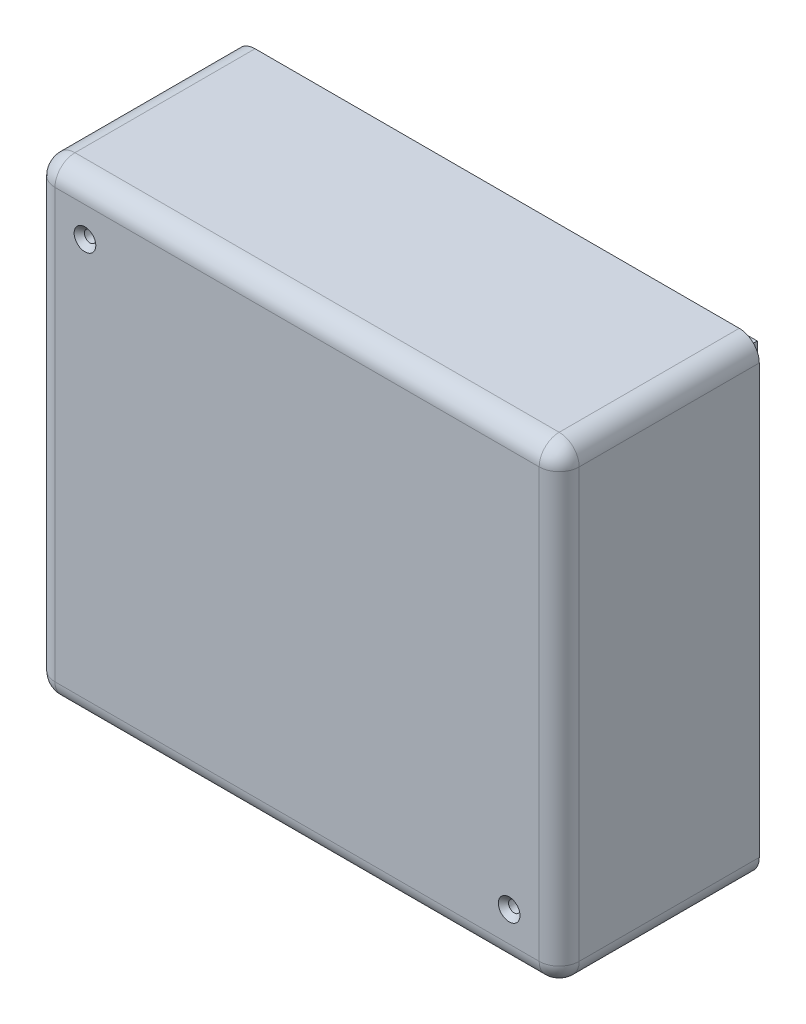
ISO-10303-21;
HEADER;
FILE_DESCRIPTION(('STEP AP214'),'2;1');
FILE_NAME('part.step','',(''),(''),'','','');
FILE_SCHEMA(('AUTOMOTIVE_DESIGN { 1 0 10303 214 1 1 1 1 }'));
ENDSEC;
DATA;
#1=APPLICATION_CONTEXT('core data for automotive mechanical design processes');
#2=APPLICATION_PROTOCOL_DEFINITION('international standard','automotive_design',2000,#1);
#3=PRODUCT_CONTEXT('',#1,'mechanical');
#4=PRODUCT('Part','Part','',(#3));
#5=PRODUCT_RELATED_PRODUCT_CATEGORY('part','',(#4));
#6=PRODUCT_DEFINITION_FORMATION('','',#4);
#7=PRODUCT_DEFINITION_CONTEXT('part definition',#1,'design');
#8=PRODUCT_DEFINITION('design','',#6,#7);
#9=PRODUCT_DEFINITION_SHAPE('','',#8);
#10=(LENGTH_UNIT() NAMED_UNIT(*) SI_UNIT(.MILLI.,.METRE.));
#11=(NAMED_UNIT(*) PLANE_ANGLE_UNIT() SI_UNIT($,.RADIAN.));
#12=(NAMED_UNIT(*) SI_UNIT($,.STERADIAN.) SOLID_ANGLE_UNIT());
#13=UNCERTAINTY_MEASURE_WITH_UNIT(LENGTH_MEASURE(1.E-05),#10,'distance_accuracy_value','');
#14=(GEOMETRIC_REPRESENTATION_CONTEXT(3) GLOBAL_UNCERTAINTY_ASSIGNED_CONTEXT((#13)) GLOBAL_UNIT_ASSIGNED_CONTEXT((#10,
#11,#12)) REPRESENTATION_CONTEXT('',''));
#15=CARTESIAN_POINT('',(0.,0.,0.));
#16=DIRECTION('',(0.,0.,1.));
#17=DIRECTION('',(1.,0.,0.));
#18=AXIS2_PLACEMENT_3D('',#15,#16,#17);
#19=CARTESIAN_POINT('',(3.04800000000001,0.,-2.54));
#20=DIRECTION('',(-1.,0.,0.));
#21=DIRECTION('',(0.,-1.,0.));
#22=AXIS2_PLACEMENT_3D('',#19,#20,#21);
#23=PLANE('',#22);
#24=DIRECTION('',(0.,0.,-1.));
#25=VECTOR('',#24,1.);
#26=CARTESIAN_POINT('',(3.048,74.168,-2.54));
#27=LINE('',#26,#25);
#28=CARTESIAN_POINT('',(3.048,74.168,0.));
#29=VERTEX_POINT('',#28);
#30=CARTESIAN_POINT('',(3.048,74.168,-2.54));
#31=VERTEX_POINT('',#30);
#32=EDGE_CURVE('E393',#29,#31,#27,.T.);
#33=ORIENTED_EDGE('',*,*,#32,.F.);
#34=DIRECTION('',(0.,-1.,0.));
#35=VECTOR('',#34,1.);
#36=CARTESIAN_POINT('',(3.04800000000001,0.,0.));
#37=LINE('',#36,#35);
#38=CARTESIAN_POINT('',(3.048,115.824,0.));
#39=VERTEX_POINT('',#38);
#40=EDGE_CURVE('E337',#39,#29,#37,.T.);
#41=ORIENTED_EDGE('',*,*,#40,.F.);
#42=DIRECTION('',(0.,0.,1.));
#43=VECTOR('',#42,1.);
#44=CARTESIAN_POINT('',(3.048,115.824,-2.54));
#45=LINE('',#44,#43);
#46=CARTESIAN_POINT('',(3.048,115.824,-2.54));
#47=VERTEX_POINT('',#46);
#48=EDGE_CURVE('E336',#47,#39,#45,.T.);
#49=ORIENTED_EDGE('',*,*,#48,.F.);
#50=DIRECTION('',(0.,-1.,0.));
#51=VECTOR('',#50,1.);
#52=CARTESIAN_POINT('',(3.04800000000001,0.,-2.54));
#53=LINE('',#52,#51);
#54=EDGE_CURVE('E324',#47,#31,#53,.T.);
#55=ORIENTED_EDGE('',*,*,#54,.T.);
#56=EDGE_LOOP('',(#33,#41,#49,#55));
#57=FACE_BOUND('',#56,.T.);
#58=ADVANCED_FACE('F105',(#57),#23,.T.);
#59=CARTESIAN_POINT('',(0.,118.872,50.8));
#60=DIRECTION('',(1.,0.,0.));
#61=DIRECTION('',(0.,1.,0.));
#62=AXIS2_PLACEMENT_3D('',#59,#60,#61);
#63=PLANE('',#62);
#64=DIRECTION('',(0.,-1.,0.));
#65=VECTOR('',#64,1.);
#66=CARTESIAN_POINT('',(0.,118.872,45.72));
#67=LINE('',#66,#65);
#68=CARTESIAN_POINT('',(0.,5.08,45.72));
#69=VERTEX_POINT('',#68);
#70=CARTESIAN_POINT('',(0.,113.792,45.72));
#71=VERTEX_POINT('',#70);
#72=EDGE_CURVE('E414',#69,#71,#67,.F.);
#73=ORIENTED_EDGE('',*,*,#72,.T.);
#74=DIRECTION('',(0.,0.,-1.));
#75=VECTOR('',#74,1.);
#76=CARTESIAN_POINT('',(0.,113.792,0.));
#77=LINE('',#76,#75);
#78=CARTESIAN_POINT('',(0.,113.792,0.));
#79=VERTEX_POINT('',#78);
#80=EDGE_CURVE('E416',#71,#79,#77,.T.);
#81=ORIENTED_EDGE('',*,*,#80,.T.);
#82=DIRECTION('',(0.,-1.,0.));
#83=VECTOR('',#82,1.);
#84=CARTESIAN_POINT('',(0.,118.872,0.));
#85=LINE('',#84,#83);
#86=CARTESIAN_POINT('',(0.,74.168,0.));
#87=VERTEX_POINT('',#86);
#88=EDGE_CURVE('E380',#79,#87,#85,.T.);
#89=ORIENTED_EDGE('',*,*,#88,.T.);
#90=DIRECTION('',(0.,0.,-1.));
#91=VECTOR('',#90,1.);
#92=CARTESIAN_POINT('',(0.,74.168,-2.54));
#93=LINE('',#92,#91);
#94=CARTESIAN_POINT('',(0.,74.168,13.9160078385243));
#95=VERTEX_POINT('',#94);
#96=EDGE_CURVE('E292',#95,#87,#93,.T.);
#97=ORIENTED_EDGE('',*,*,#96,.F.);
#98=DIRECTION('',(0.,1.,0.));
#99=VECTOR('',#98,1.);
#100=CARTESIAN_POINT('',(0.,74.168,13.9160078385243));
#101=LINE('',#100,#99);
#102=CARTESIAN_POINT('',(0.,11.684,13.9160078385243));
#103=VERTEX_POINT('',#102);
#104=EDGE_CURVE('E271',#103,#95,#101,.T.);
#105=ORIENTED_EDGE('',*,*,#104,.F.);
#106=DIRECTION('',(0.,0.,1.));
#107=VECTOR('',#106,1.);
#108=CARTESIAN_POINT('',(0.,11.684,13.9160078385243));
#109=LINE('',#108,#107);
#110=CARTESIAN_POINT('',(0.,11.684,0.));
#111=VERTEX_POINT('',#110);
#112=EDGE_CURVE('E281',#111,#103,#109,.T.);
#113=ORIENTED_EDGE('',*,*,#112,.F.);
#114=CARTESIAN_POINT('',(0.,5.08,0.));
#115=VERTEX_POINT('',#114);
#116=EDGE_CURVE('E374',#111,#115,#85,.T.);
#117=ORIENTED_EDGE('',*,*,#116,.T.);
#118=DIRECTION('',(0.,0.,-1.));
#119=VECTOR('',#118,1.);
#120=CARTESIAN_POINT('',(0.,5.08,50.8));
#121=LINE('',#120,#119);
#122=EDGE_CURVE('E412',#115,#69,#121,.F.);
#123=ORIENTED_EDGE('',*,*,#122,.T.);
#124=EDGE_LOOP('',(#73,#81,#89,#97,#105,#113,#117,#123));
#125=FACE_BOUND('',#124,.T.);
#126=ADVANCED_FACE('F290',(#125),#63,.F.);
#127=CARTESIAN_POINT('',(0.,0.,50.8));
#128=DIRECTION('',(0.,1.,0.));
#129=DIRECTION('',(0.,0.,1.));
#130=AXIS2_PLACEMENT_3D('',#127,#128,#129);
#131=PLANE('',#130);
#132=DIRECTION('',(1.,0.,0.));
#133=VECTOR('',#132,1.);
#134=CARTESIAN_POINT('',(0.,0.,0.));
#135=LINE('',#134,#133);
#136=CARTESIAN_POINT('',(5.08,0.,0.));
#137=VERTEX_POINT('',#136);
#138=CARTESIAN_POINT('',(128.016,0.,0.));
#139=VERTEX_POINT('',#138);
#140=EDGE_CURVE('E382',#137,#139,#135,.T.);
#141=ORIENTED_EDGE('',*,*,#140,.T.);
#142=DIRECTION('',(0.,0.,-1.));
#143=VECTOR('',#142,1.);
#144=CARTESIAN_POINT('',(128.016,0.,50.8));
#145=LINE('',#144,#143);
#146=CARTESIAN_POINT('',(128.016,0.,45.72));
#147=VERTEX_POINT('',#146);
#148=EDGE_CURVE('E422',#139,#147,#145,.F.);
#149=ORIENTED_EDGE('',*,*,#148,.T.);
#150=DIRECTION('',(1.,0.,0.));
#151=VECTOR('',#150,1.);
#152=CARTESIAN_POINT('',(0.,0.,45.72));
#153=LINE('',#152,#151);
#154=CARTESIAN_POINT('',(5.08,0.,45.72));
#155=VERTEX_POINT('',#154);
#156=EDGE_CURVE('E420',#147,#155,#153,.F.);
#157=ORIENTED_EDGE('',*,*,#156,.T.);
#158=DIRECTION('',(0.,0.,-1.));
#159=VECTOR('',#158,1.);
#160=CARTESIAN_POINT('',(5.08,0.,50.8));
#161=LINE('',#160,#159);
#162=EDGE_CURVE('E418',#155,#137,#161,.T.);
#163=ORIENTED_EDGE('',*,*,#162,.T.);
#164=EDGE_LOOP('',(#141,#149,#157,#163));
#165=FACE_BOUND('',#164,.T.);
#166=ADVANCED_FACE('F543',(#165),#131,.F.);
#167=CARTESIAN_POINT('',(133.096,118.872,50.8));
#168=DIRECTION('',(1.,0.,0.));
#169=DIRECTION('',(0.,0.,-1.));
#170=AXIS2_PLACEMENT_3D('',#167,#168,#169);
#171=PLANE('',#170);
#172=DIRECTION('',(0.,-1.,0.));
#173=VECTOR('',#172,1.);
#174=CARTESIAN_POINT('',(133.096,118.872,45.72));
#175=LINE('',#174,#173);
#176=CARTESIAN_POINT('',(133.096,113.792,45.72));
#177=VERTEX_POINT('',#176);
#178=CARTESIAN_POINT('',(133.096,5.08,45.72));
#179=VERTEX_POINT('',#178);
#180=EDGE_CURVE('E122',#177,#179,#175,.T.);
#181=ORIENTED_EDGE('',*,*,#180,.T.);
#182=DIRECTION('',(0.,0.,-1.));
#183=VECTOR('',#182,1.);
#184=CARTESIAN_POINT('',(133.096,5.08,0.));
#185=LINE('',#184,#183);
#186=CARTESIAN_POINT('',(133.096,5.08,0.));
#187=VERTEX_POINT('',#186);
#188=EDGE_CURVE('E426',#179,#187,#185,.T.);
#189=ORIENTED_EDGE('',*,*,#188,.T.);
#190=DIRECTION('',(0.,-1.,0.));
#191=VECTOR('',#190,1.);
#192=CARTESIAN_POINT('',(133.096,118.872,0.));
#193=LINE('',#192,#191);
#194=CARTESIAN_POINT('',(133.096,113.792,0.));
#195=VERTEX_POINT('',#194);
#196=EDGE_CURVE('E385',#195,#187,#193,.T.);
#197=ORIENTED_EDGE('',*,*,#196,.F.);
#198=DIRECTION('',(0.,0.,-1.));
#199=VECTOR('',#198,1.);
#200=CARTESIAN_POINT('',(133.096,113.792,50.8));
#201=LINE('',#200,#199);
#202=EDGE_CURVE('E127',#195,#177,#201,.F.);
#203=ORIENTED_EDGE('',*,*,#202,.T.);
#204=EDGE_LOOP('',(#181,#189,#197,#203));
#205=FACE_BOUND('',#204,.T.);
#206=ADVANCED_FACE('F869',(#205),#171,.T.);
#207=CARTESIAN_POINT('',(0.,118.872,50.8));
#208=DIRECTION('',(0.,1.,0.));
#209=DIRECTION('',(-1.,0.,0.));
#210=AXIS2_PLACEMENT_3D('',#207,#208,#209);
#211=PLANE('',#210);
#212=DIRECTION('',(1.,0.,0.));
#213=VECTOR('',#212,1.);
#214=CARTESIAN_POINT('',(0.,118.872,45.72));
#215=LINE('',#214,#213);
#216=CARTESIAN_POINT('',(5.07999999999996,118.872,45.72));
#217=VERTEX_POINT('',#216);
#218=CARTESIAN_POINT('',(128.016,118.872,45.72));
#219=VERTEX_POINT('',#218);
#220=EDGE_CURVE('E398',#217,#219,#215,.T.);
#221=ORIENTED_EDGE('',*,*,#220,.T.);
#222=DIRECTION('',(0.,0.,-1.));
#223=VECTOR('',#222,1.);
#224=CARTESIAN_POINT('',(128.016,118.872,50.8));
#225=LINE('',#224,#223);
#226=CARTESIAN_POINT('',(128.016,118.872,0.));
#227=VERTEX_POINT('',#226);
#228=EDGE_CURVE('E401',#219,#227,#225,.T.);
#229=ORIENTED_EDGE('',*,*,#228,.T.);
#230=DIRECTION('',(1.,0.,0.));
#231=VECTOR('',#230,1.);
#232=CARTESIAN_POINT('',(0.,118.872,0.));
#233=LINE('',#232,#231);
#234=CARTESIAN_POINT('',(5.07999999999996,118.872,0.));
#235=VERTEX_POINT('',#234);
#236=EDGE_CURVE('E388',#235,#227,#233,.T.);
#237=ORIENTED_EDGE('',*,*,#236,.F.);
#238=DIRECTION('',(0.,0.,-1.));
#239=VECTOR('',#238,1.);
#240=CARTESIAN_POINT('',(5.07999999999996,118.872,50.8));
#241=LINE('',#240,#239);
#242=EDGE_CURVE('E396',#235,#217,#241,.F.);
#243=ORIENTED_EDGE('',*,*,#242,.T.);
#244=EDGE_LOOP('',(#221,#229,#237,#243));
#245=FACE_BOUND('',#244,.T.);
#246=ADVANCED_FACE('F490',(#245),#211,.T.);
#247=CARTESIAN_POINT('',(0.,0.,50.8));
#248=DIRECTION('',(0.,0.,1.));
#249=DIRECTION('',(1.,0.,0.));
#250=AXIS2_PLACEMENT_3D('',#247,#248,#249);
#251=PLANE('',#250);
#252=CARTESIAN_POINT('',(12.7,106.172,50.8));
#253=DIRECTION('',(0.,0.,1.));
#254=DIRECTION('',(1.,0.,0.));
#255=AXIS2_PLACEMENT_3D('',#252,#253,#254);
#256=CIRCLE('',#255,2.75);
#257=CARTESIAN_POINT('',(15.45,106.172,50.8));
#258=VERTEX_POINT('',#257);
#259=EDGE_CURVE('E480',#258,#258,#256,.T.);
#260=ORIENTED_EDGE('',*,*,#259,.F.);
#261=EDGE_LOOP('',(#260));
#262=FACE_BOUND('',#261,.T.);
#263=CARTESIAN_POINT('',(120.396,12.7,50.8));
#264=DIRECTION('',(0.,0.,1.));
#265=DIRECTION('',(1.,0.,0.));
#266=AXIS2_PLACEMENT_3D('',#263,#264,#265);
#267=CIRCLE('',#266,2.75);
#268=CARTESIAN_POINT('',(123.146,12.7,50.8));
#269=VERTEX_POINT('',#268);
#270=EDGE_CURVE('E471',#269,#269,#267,.T.);
#271=ORIENTED_EDGE('',*,*,#270,.F.);
#272=EDGE_LOOP('',(#271));
#273=FACE_BOUND('',#272,.T.);
#274=DIRECTION('',(0.,-1.,0.));
#275=VECTOR('',#274,1.);
#276=CARTESIAN_POINT('',(128.016,0.,50.8));
#277=LINE('',#276,#275);
#278=CARTESIAN_POINT('',(128.016,5.08,50.8));
#279=VERTEX_POINT('',#278);
#280=CARTESIAN_POINT('',(128.016,113.792,50.8));
#281=VERTEX_POINT('',#280);
#282=EDGE_CURVE('E403',#279,#281,#277,.F.);
#283=ORIENTED_EDGE('',*,*,#282,.T.);
#284=DIRECTION('',(1.,0.,0.));
#285=VECTOR('',#284,1.);
#286=CARTESIAN_POINT('',(0.,113.792,50.8));
#287=LINE('',#286,#285);
#288=CARTESIAN_POINT('',(5.07999999999997,113.792,50.8));
#289=VERTEX_POINT('',#288);
#290=EDGE_CURVE('E409',#281,#289,#287,.F.);
#291=ORIENTED_EDGE('',*,*,#290,.T.);
#292=DIRECTION('',(0.,-1.,0.));
#293=VECTOR('',#292,1.);
#294=CARTESIAN_POINT('',(5.08,0.,50.8));
#295=LINE('',#294,#293);
#296=CARTESIAN_POINT('',(5.08,5.08,50.8));
#297=VERTEX_POINT('',#296);
#298=EDGE_CURVE('E407',#289,#297,#295,.T.);
#299=ORIENTED_EDGE('',*,*,#298,.T.);
#300=DIRECTION('',(1.,0.,0.));
#301=VECTOR('',#300,1.);
#302=CARTESIAN_POINT('',(133.096,5.08,50.8));
#303=LINE('',#302,#301);
#304=EDGE_CURVE('E405',#297,#279,#303,.T.);
#305=ORIENTED_EDGE('',*,*,#304,.T.);
#306=EDGE_LOOP('',(#283,#291,#299,#305));
#307=FACE_BOUND('',#306,.T.);
#308=ADVANCED_FACE('F486',(#262,#273,#307),#251,.T.);
#309=CARTESIAN_POINT('',(0.,0.,0.));
#310=DIRECTION('',(0.,0.,1.));
#311=DIRECTION('',(1.,0.,0.));
#312=AXIS2_PLACEMENT_3D('',#309,#310,#311);
#313=PLANE('',#312);
#314=ORIENTED_EDGE('',*,*,#196,.T.);
#315=CARTESIAN_POINT('',(128.016,5.08,0.));
#316=DIRECTION('',(0.,0.,1.));
#317=DIRECTION('',(1.,0.,0.));
#318=AXIS2_PLACEMENT_3D('',#315,#316,#317);
#319=CIRCLE('',#318,5.08);
#320=EDGE_CURVE('E12',#187,#139,#319,.F.);
#321=ORIENTED_EDGE('',*,*,#320,.T.);
#322=ORIENTED_EDGE('',*,*,#140,.F.);
#323=CARTESIAN_POINT('',(5.08,5.08,0.));
#324=DIRECTION('',(0.,0.,1.));
#325=DIRECTION('',(1.,0.,0.));
#326=AXIS2_PLACEMENT_3D('',#323,#324,#325);
#327=CIRCLE('',#326,5.08);
#328=EDGE_CURVE('E428',#137,#115,#327,.F.);
#329=ORIENTED_EDGE('',*,*,#328,.T.);
#330=ORIENTED_EDGE('',*,*,#116,.F.);
#331=DIRECTION('',(1.,0.,0.));
#332=VECTOR('',#331,1.);
#333=CARTESIAN_POINT('',(0.,11.684,0.));
#334=LINE('',#333,#332);
#335=CARTESIAN_POINT('',(3.04800000000001,11.684,0.));
#336=VERTEX_POINT('',#335);
#337=EDGE_CURVE('E284',#111,#336,#334,.T.);
#338=ORIENTED_EDGE('',*,*,#337,.T.);
#339=CARTESIAN_POINT('',(3.04800000000001,3.048,0.));
#340=VERTEX_POINT('',#339);
#341=EDGE_CURVE('E323',#336,#340,#37,.T.);
#342=ORIENTED_EDGE('',*,*,#341,.T.);
#343=DIRECTION('',(1.,0.,0.));
#344=VECTOR('',#343,1.);
#345=CARTESIAN_POINT('',(0.,3.048,0.));
#346=LINE('',#345,#344);
#347=CARTESIAN_POINT('',(130.048,3.048,0.));
#348=VERTEX_POINT('',#347);
#349=EDGE_CURVE('E346',#340,#348,#346,.T.);
#350=ORIENTED_EDGE('',*,*,#349,.T.);
#351=DIRECTION('',(0.,-1.,0.));
#352=VECTOR('',#351,1.);
#353=CARTESIAN_POINT('',(130.048,0.,0.));
#354=LINE('',#353,#352);
#355=CARTESIAN_POINT('',(130.048,115.824,0.));
#356=VERTEX_POINT('',#355);
#357=EDGE_CURVE('E343',#356,#348,#354,.T.);
#358=ORIENTED_EDGE('',*,*,#357,.F.);
#359=DIRECTION('',(1.,0.,0.));
#360=VECTOR('',#359,1.);
#361=CARTESIAN_POINT('',(0.,115.824,0.));
#362=LINE('',#361,#360);
#363=EDGE_CURVE('E340',#39,#356,#362,.T.);
#364=ORIENTED_EDGE('',*,*,#363,.F.);
#365=ORIENTED_EDGE('',*,*,#40,.T.);
#366=DIRECTION('',(-1.,0.,0.));
#367=VECTOR('',#366,1.);
#368=CARTESIAN_POINT('',(0.,74.168,0.));
#369=LINE('',#368,#367);
#370=EDGE_CURVE('E305',#29,#87,#369,.T.);
#371=ORIENTED_EDGE('',*,*,#370,.T.);
#372=ORIENTED_EDGE('',*,*,#88,.F.);
#373=CARTESIAN_POINT('',(5.07999999999997,113.792,0.));
#374=DIRECTION('',(0.,0.,1.));
#375=DIRECTION('',(1.,0.,0.));
#376=AXIS2_PLACEMENT_3D('',#373,#374,#375);
#377=CIRCLE('',#376,5.08);
#378=EDGE_CURVE('E430',#79,#235,#377,.F.);
#379=ORIENTED_EDGE('',*,*,#378,.T.);
#380=ORIENTED_EDGE('',*,*,#236,.T.);
#381=CARTESIAN_POINT('',(128.016,113.792,0.));
#382=DIRECTION('',(0.,0.,1.));
#383=DIRECTION('',(1.,0.,0.));
#384=AXIS2_PLACEMENT_3D('',#381,#382,#383);
#385=CIRCLE('',#384,5.08);
#386=EDGE_CURVE('E114',#227,#195,#385,.F.);
#387=ORIENTED_EDGE('',*,*,#386,.T.);
#388=EDGE_LOOP('',(#314,#321,#322,#329,#330,#338,#342,#350,#358,#364,#365,#371,#372,#379,#380,#387));
#389=FACE_BOUND('',#388,.T.);
#390=ADVANCED_FACE('F489',(#389),#313,.F.);
#391=CARTESIAN_POINT('',(0.,0.,-2.54));
#392=DIRECTION('',(0.,0.,-1.));
#393=DIRECTION('',(-1.,0.,0.));
#394=AXIS2_PLACEMENT_3D('',#391,#392,#393);
#395=PLANE('',#394);
#396=DIRECTION('',(-1.,0.,0.));
#397=VECTOR('',#396,1.);
#398=CARTESIAN_POINT('',(12.7,74.168,-2.54));
#399=LINE('',#398,#397);
#400=CARTESIAN_POINT('',(5.58800000000001,74.168,-2.54));
#401=VERTEX_POINT('',#400);
#402=EDGE_CURVE('E297',#401,#31,#399,.T.);
#403=ORIENTED_EDGE('',*,*,#402,.T.);
#404=ORIENTED_EDGE('',*,*,#54,.F.);
#405=DIRECTION('',(1.,0.,0.));
#406=VECTOR('',#405,1.);
#407=CARTESIAN_POINT('',(0.,115.824,-2.54));
#408=LINE('',#407,#406);
#409=CARTESIAN_POINT('',(130.048,115.824,-2.54));
#410=VERTEX_POINT('',#409);
#411=EDGE_CURVE('E327',#47,#410,#408,.T.);
#412=ORIENTED_EDGE('',*,*,#411,.T.);
#413=DIRECTION('',(0.,-1.,0.));
#414=VECTOR('',#413,1.);
#415=CARTESIAN_POINT('',(130.048,0.,-2.54));
#416=LINE('',#415,#414);
#417=CARTESIAN_POINT('',(130.048,3.048,-2.54));
#418=VERTEX_POINT('',#417);
#419=EDGE_CURVE('E331',#410,#418,#416,.T.);
#420=ORIENTED_EDGE('',*,*,#419,.T.);
#421=DIRECTION('',(1.,0.,0.));
#422=VECTOR('',#421,1.);
#423=CARTESIAN_POINT('',(0.,3.048,-2.54));
#424=LINE('',#423,#422);
#425=CARTESIAN_POINT('',(3.04800000000001,3.048,-2.54));
#426=VERTEX_POINT('',#425);
#427=EDGE_CURVE('E334',#426,#418,#424,.T.);
#428=ORIENTED_EDGE('',*,*,#427,.F.);
#429=CARTESIAN_POINT('',(3.04800000000001,11.684,-2.54));
#430=VERTEX_POINT('',#429);
#431=EDGE_CURVE('E328',#430,#426,#53,.T.);
#432=ORIENTED_EDGE('',*,*,#431,.F.);
#433=DIRECTION('',(-1.,0.,0.));
#434=VECTOR('',#433,1.);
#435=CARTESIAN_POINT('',(12.7,11.684,-2.54));
#436=LINE('',#435,#434);
#437=CARTESIAN_POINT('',(5.58800000000001,11.684,-2.54));
#438=VERTEX_POINT('',#437);
#439=EDGE_CURVE('E278',#438,#430,#436,.T.);
#440=ORIENTED_EDGE('',*,*,#439,.F.);
#441=DIRECTION('',(0.,-1.,0.));
#442=VECTOR('',#441,1.);
#443=CARTESIAN_POINT('',(5.58800000000001,0.,-2.54));
#444=LINE('',#443,#442);
#445=CARTESIAN_POINT('',(5.58800000000002,5.588,-2.54));
#446=VERTEX_POINT('',#445);
#447=EDGE_CURVE('E351',#438,#446,#444,.T.);
#448=ORIENTED_EDGE('',*,*,#447,.T.);
#449=DIRECTION('',(1.,0.,0.));
#450=VECTOR('',#449,1.);
#451=CARTESIAN_POINT('',(0.,5.588,-2.54));
#452=LINE('',#451,#450);
#453=CARTESIAN_POINT('',(127.508,5.588,-2.54));
#454=VERTEX_POINT('',#453);
#455=EDGE_CURVE('E363',#446,#454,#452,.T.);
#456=ORIENTED_EDGE('',*,*,#455,.T.);
#457=DIRECTION('',(0.,-1.,0.));
#458=VECTOR('',#457,1.);
#459=CARTESIAN_POINT('',(127.508,0.,-2.54));
#460=LINE('',#459,#458);
#461=CARTESIAN_POINT('',(127.508,113.284,-2.54));
#462=VERTEX_POINT('',#461);
#463=EDGE_CURVE('E366',#462,#454,#460,.T.);
#464=ORIENTED_EDGE('',*,*,#463,.F.);
#465=DIRECTION('',(1.,0.,0.));
#466=VECTOR('',#465,1.);
#467=CARTESIAN_POINT('',(0.,113.284,-2.54));
#468=LINE('',#467,#466);
#469=CARTESIAN_POINT('',(5.588,113.284,-2.54));
#470=VERTEX_POINT('',#469);
#471=EDGE_CURVE('E369',#470,#462,#468,.T.);
#472=ORIENTED_EDGE('',*,*,#471,.F.);
#473=EDGE_CURVE('E360',#470,#401,#444,.T.);
#474=ORIENTED_EDGE('',*,*,#473,.T.);
#475=EDGE_LOOP('',(#403,#404,#412,#420,#428,#432,#440,#448,#456,#464,#472,#474));
#476=FACE_BOUND('',#475,.T.);
#477=ADVANCED_FACE('F592',(#476),#395,.T.);
#478=CARTESIAN_POINT('',(5.58800000000001,0.,-2.54));
#479=DIRECTION('',(-1.,0.,0.));
#480=DIRECTION('',(0.,-1.,0.));
#481=AXIS2_PLACEMENT_3D('',#478,#479,#480);
#482=PLANE('',#481);
#483=DIRECTION('',(0.,1.,0.));
#484=VECTOR('',#483,1.);
#485=CARTESIAN_POINT('',(5.58800000000001,0.,13.9160078385243));
#486=LINE('',#485,#484);
#487=CARTESIAN_POINT('',(5.58800000000001,11.684,13.9160078385243));
#488=VERTEX_POINT('',#487);
#489=CARTESIAN_POINT('',(5.58800000000001,74.168,13.9160078385243));
#490=VERTEX_POINT('',#489);
#491=EDGE_CURVE('E274',#488,#490,#486,.T.);
#492=ORIENTED_EDGE('',*,*,#491,.T.);
#493=DIRECTION('',(0.,0.,-1.));
#494=VECTOR('',#493,1.);
#495=CARTESIAN_POINT('',(5.58800000000001,74.168,-2.54));
#496=LINE('',#495,#494);
#497=EDGE_CURVE('E308',#490,#401,#496,.T.);
#498=ORIENTED_EDGE('',*,*,#497,.T.);
#499=ORIENTED_EDGE('',*,*,#473,.F.);
#500=DIRECTION('',(0.,0.,1.));
#501=VECTOR('',#500,1.);
#502=CARTESIAN_POINT('',(5.588,113.284,-2.54));
#503=LINE('',#502,#501);
#504=CARTESIAN_POINT('',(5.58800000000002,113.284,46.99));
#505=VERTEX_POINT('',#504);
#506=EDGE_CURVE('E372',#470,#505,#503,.T.);
#507=ORIENTED_EDGE('',*,*,#506,.T.);
#508=DIRECTION('',(0.,1.,0.));
#509=VECTOR('',#508,1.);
#510=CARTESIAN_POINT('',(5.58800000000002,113.284,46.99));
#511=LINE('',#510,#509);
#512=CARTESIAN_POINT('',(5.58800000000002,5.588,46.99));
#513=VERTEX_POINT('',#512);
#514=EDGE_CURVE('E317',#513,#505,#511,.T.);
#515=ORIENTED_EDGE('',*,*,#514,.F.);
#516=DIRECTION('',(0.,0.,1.));
#517=VECTOR('',#516,1.);
#518=CARTESIAN_POINT('',(5.58800000000002,5.588,-2.54));
#519=LINE('',#518,#517);
#520=EDGE_CURVE('E371',#446,#513,#519,.T.);
#521=ORIENTED_EDGE('',*,*,#520,.F.);
#522=ORIENTED_EDGE('',*,*,#447,.F.);
#523=DIRECTION('',(0.,0.,1.));
#524=VECTOR('',#523,1.);
#525=CARTESIAN_POINT('',(5.58800000000001,11.684,-2.54));
#526=LINE('',#525,#524);
#527=EDGE_CURVE('E303',#438,#488,#526,.T.);
#528=ORIENTED_EDGE('',*,*,#527,.T.);
#529=EDGE_LOOP('',(#492,#498,#499,#507,#515,#521,#522,#528));
#530=FACE_BOUND('',#529,.T.);
#531=ADVANCED_FACE('F607',(#530),#482,.F.);
#532=CARTESIAN_POINT('',(0.,113.284,-2.54));
#533=DIRECTION('',(0.,-1.,0.));
#534=DIRECTION('',(0.,0.,-1.));
#535=AXIS2_PLACEMENT_3D('',#532,#533,#534);
#536=PLANE('',#535);
#537=DIRECTION('',(0.,0.,1.));
#538=VECTOR('',#537,1.);
#539=CARTESIAN_POINT('',(127.508,113.284,-2.54));
#540=LINE('',#539,#538);
#541=CARTESIAN_POINT('',(127.508,113.284,46.99));
#542=VERTEX_POINT('',#541);
#543=EDGE_CURVE('E375',#462,#542,#540,.T.);
#544=ORIENTED_EDGE('',*,*,#543,.T.);
#545=DIRECTION('',(1.,0.,0.));
#546=VECTOR('',#545,1.);
#547=CARTESIAN_POINT('',(127.508,113.284,46.99));
#548=LINE('',#547,#546);
#549=EDGE_CURVE('E320',#505,#542,#548,.T.);
#550=ORIENTED_EDGE('',*,*,#549,.F.);
#551=ORIENTED_EDGE('',*,*,#506,.F.);
#552=ORIENTED_EDGE('',*,*,#471,.T.);
#553=EDGE_LOOP('',(#544,#550,#551,#552));
#554=FACE_BOUND('',#553,.T.);
#555=ADVANCED_FACE('F618',(#554),#536,.T.);
#556=CARTESIAN_POINT('',(127.508,0.,-2.54));
#557=DIRECTION('',(-1.,0.,0.));
#558=DIRECTION('',(0.,-1.,0.));
#559=AXIS2_PLACEMENT_3D('',#556,#557,#558);
#560=PLANE('',#559);
#561=DIRECTION('',(0.,0.,1.));
#562=VECTOR('',#561,1.);
#563=CARTESIAN_POINT('',(127.508,5.588,-2.54));
#564=LINE('',#563,#562);
#565=CARTESIAN_POINT('',(127.508,5.588,46.99));
#566=VERTEX_POINT('',#565);
#567=EDGE_CURVE('E377',#454,#566,#564,.T.);
#568=ORIENTED_EDGE('',*,*,#567,.T.);
#569=DIRECTION('',(0.,-1.,0.));
#570=VECTOR('',#569,1.);
#571=CARTESIAN_POINT('',(127.508,113.284,46.99));
#572=LINE('',#571,#570);
#573=EDGE_CURVE('E311',#542,#566,#572,.T.);
#574=ORIENTED_EDGE('',*,*,#573,.F.);
#575=ORIENTED_EDGE('',*,*,#543,.F.);
#576=ORIENTED_EDGE('',*,*,#463,.T.);
#577=EDGE_LOOP('',(#568,#574,#575,#576));
#578=FACE_BOUND('',#577,.T.);
#579=ADVANCED_FACE('F582',(#578),#560,.T.);
#580=CARTESIAN_POINT('',(0.,5.588,-2.54));
#581=DIRECTION('',(0.,-1.,0.));
#582=DIRECTION('',(0.,0.,-1.));
#583=AXIS2_PLACEMENT_3D('',#580,#581,#582);
#584=PLANE('',#583);
#585=ORIENTED_EDGE('',*,*,#520,.T.);
#586=DIRECTION('',(-1.,0.,0.));
#587=VECTOR('',#586,1.);
#588=CARTESIAN_POINT('',(127.508,5.588,46.99));
#589=LINE('',#588,#587);
#590=EDGE_CURVE('E314',#566,#513,#589,.T.);
#591=ORIENTED_EDGE('',*,*,#590,.F.);
#592=ORIENTED_EDGE('',*,*,#567,.F.);
#593=ORIENTED_EDGE('',*,*,#455,.F.);
#594=EDGE_LOOP('',(#585,#591,#592,#593));
#595=FACE_BOUND('',#594,.T.);
#596=ADVANCED_FACE('F573',(#595),#584,.F.);
#597=DIRECTION('',(0.,0.,1.));
#598=VECTOR('',#597,1.);
#599=CARTESIAN_POINT('',(3.04800000000001,11.684,-2.54));
#600=LINE('',#599,#598);
#601=EDGE_CURVE('E391',#430,#336,#600,.T.);
#602=ORIENTED_EDGE('',*,*,#601,.F.);
#603=ORIENTED_EDGE('',*,*,#431,.T.);
#604=DIRECTION('',(0.,0.,1.));
#605=VECTOR('',#604,1.);
#606=CARTESIAN_POINT('',(3.04800000000001,3.048,-2.54));
#607=LINE('',#606,#605);
#608=EDGE_CURVE('E348',#426,#340,#607,.T.);
#609=ORIENTED_EDGE('',*,*,#608,.T.);
#610=ORIENTED_EDGE('',*,*,#341,.F.);
#611=EDGE_LOOP('',(#602,#603,#609,#610));
#612=FACE_BOUND('',#611,.T.);
#613=ADVANCED_FACE('F563',(#612),#23,.T.);
#614=CARTESIAN_POINT('',(0.,3.048,-2.54));
#615=DIRECTION('',(0.,-1.,0.));
#616=DIRECTION('',(0.,0.,-1.));
#617=AXIS2_PLACEMENT_3D('',#614,#615,#616);
#618=PLANE('',#617);
#619=ORIENTED_EDGE('',*,*,#349,.F.);
#620=ORIENTED_EDGE('',*,*,#608,.F.);
#621=ORIENTED_EDGE('',*,*,#427,.T.);
#622=DIRECTION('',(0.,0.,1.));
#623=VECTOR('',#622,1.);
#624=CARTESIAN_POINT('',(130.048,3.048,-2.54));
#625=LINE('',#624,#623);
#626=EDGE_CURVE('E352',#418,#348,#625,.T.);
#627=ORIENTED_EDGE('',*,*,#626,.T.);
#628=EDGE_LOOP('',(#619,#620,#621,#627));
#629=FACE_BOUND('',#628,.T.);
#630=ADVANCED_FACE('F572',(#629),#618,.T.);
#631=CARTESIAN_POINT('',(130.048,0.,-2.54));
#632=DIRECTION('',(-1.,0.,0.));
#633=DIRECTION('',(0.,-1.,0.));
#634=AXIS2_PLACEMENT_3D('',#631,#632,#633);
#635=PLANE('',#634);
#636=ORIENTED_EDGE('',*,*,#357,.T.);
#637=ORIENTED_EDGE('',*,*,#626,.F.);
#638=ORIENTED_EDGE('',*,*,#419,.F.);
#639=DIRECTION('',(0.,0.,1.));
#640=VECTOR('',#639,1.);
#641=CARTESIAN_POINT('',(130.048,115.824,-2.54));
#642=LINE('',#641,#640);
#643=EDGE_CURVE('E355',#410,#356,#642,.T.);
#644=ORIENTED_EDGE('',*,*,#643,.T.);
#645=EDGE_LOOP('',(#636,#637,#638,#644));
#646=FACE_BOUND('',#645,.T.);
#647=ADVANCED_FACE('F579',(#646),#635,.F.);
#648=CARTESIAN_POINT('',(0.,115.824,-2.54));
#649=DIRECTION('',(0.,-1.,0.));
#650=DIRECTION('',(0.,0.,-1.));
#651=AXIS2_PLACEMENT_3D('',#648,#649,#650);
#652=PLANE('',#651);
#653=ORIENTED_EDGE('',*,*,#363,.T.);
#654=ORIENTED_EDGE('',*,*,#643,.F.);
#655=ORIENTED_EDGE('',*,*,#411,.F.);
#656=ORIENTED_EDGE('',*,*,#48,.T.);
#657=EDGE_LOOP('',(#653,#654,#655,#656));
#658=FACE_BOUND('',#657,.T.);
#659=ADVANCED_FACE('F622',(#658),#652,.F.);
#660=CARTESIAN_POINT('',(0.,0.,46.99));
#661=DIRECTION('',(0.,0.,-1.));
#662=DIRECTION('',(-1.,0.,0.));
#663=AXIS2_PLACEMENT_3D('',#660,#661,#662);
#664=PLANE('',#663);
#665=CARTESIAN_POINT('',(12.7,106.172,46.99));
#666=DIRECTION('',(0.,0.,-1.));
#667=DIRECTION('',(-1.,0.,0.));
#668=AXIS2_PLACEMENT_3D('',#665,#666,#667);
#669=CIRCLE('',#668,1.44999999999999);
#670=CARTESIAN_POINT('',(11.25,106.172,46.99));
#671=VERTEX_POINT('',#670);
#672=EDGE_CURVE('E109',#671,#671,#669,.T.);
#673=ORIENTED_EDGE('',*,*,#672,.F.);
#674=EDGE_LOOP('',(#673));
#675=FACE_BOUND('',#674,.T.);
#676=CARTESIAN_POINT('',(120.396,12.7,46.99));
#677=DIRECTION('',(0.,0.,-1.));
#678=DIRECTION('',(-1.,0.,0.));
#679=AXIS2_PLACEMENT_3D('',#676,#677,#678);
#680=CIRCLE('',#679,1.44999999999999);
#681=CARTESIAN_POINT('',(118.946,12.7,46.99));
#682=VERTEX_POINT('',#681);
#683=EDGE_CURVE('E436',#682,#682,#680,.T.);
#684=ORIENTED_EDGE('',*,*,#683,.F.);
#685=EDGE_LOOP('',(#684));
#686=FACE_BOUND('',#685,.T.);
#687=ORIENTED_EDGE('',*,*,#573,.T.);
#688=ORIENTED_EDGE('',*,*,#590,.T.);
#689=ORIENTED_EDGE('',*,*,#514,.T.);
#690=ORIENTED_EDGE('',*,*,#549,.T.);
#691=EDGE_LOOP('',(#687,#688,#689,#690));
#692=FACE_BOUND('',#691,.T.);
#693=ADVANCED_FACE('F620',(#675,#686,#692),#664,.T.);
#694=CARTESIAN_POINT('',(12.7,74.168,13.9160078385243));
#695=DIRECTION('',(0.,0.,1.));
#696=DIRECTION('',(0.,-1.,0.));
#697=AXIS2_PLACEMENT_3D('',#694,#695,#696);
#698=PLANE('',#697);
#699=DIRECTION('',(-1.,0.,0.));
#700=VECTOR('',#699,1.);
#701=CARTESIAN_POINT('',(12.7,11.684,13.9160078385243));
#702=LINE('',#701,#700);
#703=EDGE_CURVE('E266',#488,#103,#702,.T.);
#704=ORIENTED_EDGE('',*,*,#703,.T.);
#705=ORIENTED_EDGE('',*,*,#104,.T.);
#706=DIRECTION('',(-1.,0.,0.));
#707=VECTOR('',#706,1.);
#708=CARTESIAN_POINT('',(12.7,74.168,13.9160078385243));
#709=LINE('',#708,#707);
#710=EDGE_CURVE('E277',#490,#95,#709,.T.);
#711=ORIENTED_EDGE('',*,*,#710,.F.);
#712=ORIENTED_EDGE('',*,*,#491,.F.);
#713=EDGE_LOOP('',(#704,#705,#711,#712));
#714=FACE_BOUND('',#713,.T.);
#715=ADVANCED_FACE('F268',(#714),#698,.F.);
#716=CARTESIAN_POINT('',(12.7,74.168,-2.54));
#717=DIRECTION('',(0.,1.,0.));
#718=DIRECTION('',(-1.,0.,0.));
#719=AXIS2_PLACEMENT_3D('',#716,#717,#718);
#720=PLANE('',#719);
#721=ORIENTED_EDGE('',*,*,#710,.T.);
#722=ORIENTED_EDGE('',*,*,#96,.T.);
#723=ORIENTED_EDGE('',*,*,#370,.F.);
#724=ORIENTED_EDGE('',*,*,#32,.T.);
#725=ORIENTED_EDGE('',*,*,#402,.F.);
#726=ORIENTED_EDGE('',*,*,#497,.F.);
#727=EDGE_LOOP('',(#721,#722,#723,#724,#725,#726));
#728=FACE_BOUND('',#727,.T.);
#729=ADVANCED_FACE('F601',(#728),#720,.F.);
#730=CARTESIAN_POINT('',(12.7,11.684,13.9160078385243));
#731=DIRECTION('',(0.,-1.,0.));
#732=DIRECTION('',(1.,0.,0.));
#733=AXIS2_PLACEMENT_3D('',#730,#731,#732);
#734=PLANE('',#733);
#735=ORIENTED_EDGE('',*,*,#439,.T.);
#736=ORIENTED_EDGE('',*,*,#601,.T.);
#737=ORIENTED_EDGE('',*,*,#337,.F.);
#738=ORIENTED_EDGE('',*,*,#112,.T.);
#739=ORIENTED_EDGE('',*,*,#703,.F.);
#740=ORIENTED_EDGE('',*,*,#527,.F.);
#741=EDGE_LOOP('',(#735,#736,#737,#738,#739,#740));
#742=FACE_BOUND('',#741,.T.);
#743=ADVANCED_FACE('F282',(#742),#734,.F.);
#744=CARTESIAN_POINT('',(5.08,5.08,50.8));
#745=DIRECTION('',(0.,0.,-1.));
#746=DIRECTION('',(-1.,0.,0.));
#747=AXIS2_PLACEMENT_3D('',#744,#745,#746);
#748=CYLINDRICAL_SURFACE('',#747,5.08);
#749=ORIENTED_EDGE('',*,*,#328,.F.);
#750=ORIENTED_EDGE('',*,*,#162,.F.);
#751=CARTESIAN_POINT('',(5.08,5.08,45.72));
#752=DIRECTION('',(0.,0.,1.));
#753=DIRECTION('',(1.,0.,0.));
#754=AXIS2_PLACEMENT_3D('',#751,#752,#753);
#755=CIRCLE('',#754,5.08);
#756=EDGE_CURVE('E462',#69,#155,#755,.T.);
#757=ORIENTED_EDGE('',*,*,#756,.F.);
#758=ORIENTED_EDGE('',*,*,#122,.F.);
#759=EDGE_LOOP('',(#749,#750,#757,#758));
#760=FACE_BOUND('',#759,.T.);
#761=ADVANCED_FACE('F107',(#760),#748,.T.);
#762=CARTESIAN_POINT('',(128.016,5.08,50.8));
#763=DIRECTION('',(0.,0.,1.));
#764=DIRECTION('',(1.,0.,0.));
#765=AXIS2_PLACEMENT_3D('',#762,#763,#764);
#766=CYLINDRICAL_SURFACE('',#765,5.08);
#767=ORIENTED_EDGE('',*,*,#320,.F.);
#768=ORIENTED_EDGE('',*,*,#188,.F.);
#769=CARTESIAN_POINT('',(128.016,5.08,45.72));
#770=DIRECTION('',(0.,0.,1.));
#771=DIRECTION('',(1.,0.,0.));
#772=AXIS2_PLACEMENT_3D('',#769,#770,#771);
#773=CIRCLE('',#772,5.08);
#774=EDGE_CURVE('E459',#147,#179,#773,.T.);
#775=ORIENTED_EDGE('',*,*,#774,.F.);
#776=ORIENTED_EDGE('',*,*,#148,.F.);
#777=EDGE_LOOP('',(#767,#768,#775,#776));
#778=FACE_BOUND('',#777,.T.);
#779=ADVANCED_FACE('F548',(#778),#766,.T.);
#780=CARTESIAN_POINT('',(0.,5.08,45.72));
#781=DIRECTION('',(-1.,0.,0.));
#782=DIRECTION('',(0.,0.,1.));
#783=AXIS2_PLACEMENT_3D('',#780,#781,#782);
#784=CYLINDRICAL_SURFACE('',#783,5.08);
#785=CARTESIAN_POINT('',(5.08,5.08,45.72));
#786=DIRECTION('',(-1.,0.,0.));
#787=DIRECTION('',(0.,0.,1.));
#788=AXIS2_PLACEMENT_3D('',#785,#786,#787);
#789=CIRCLE('',#788,5.08);
#790=EDGE_CURVE('E288',#155,#297,#789,.T.);
#791=ORIENTED_EDGE('',*,*,#790,.F.);
#792=ORIENTED_EDGE('',*,*,#156,.F.);
#793=CARTESIAN_POINT('',(128.016,5.08,45.72));
#794=DIRECTION('',(1.,0.,0.));
#795=DIRECTION('',(0.,0.,-1.));
#796=AXIS2_PLACEMENT_3D('',#793,#794,#795);
#797=CIRCLE('',#796,5.08);
#798=EDGE_CURVE('E456',#279,#147,#797,.T.);
#799=ORIENTED_EDGE('',*,*,#798,.F.);
#800=ORIENTED_EDGE('',*,*,#304,.F.);
#801=EDGE_LOOP('',(#791,#792,#799,#800));
#802=FACE_BOUND('',#801,.T.);
#803=ADVANCED_FACE('F531',(#802),#784,.T.);
#804=CARTESIAN_POINT('',(5.08,5.08,45.72));
#805=DIRECTION('',(0.,-1.,0.));
#806=DIRECTION('',(0.,0.,-1.));
#807=AXIS2_PLACEMENT_3D('',#804,#805,#806);
#808=SPHERICAL_SURFACE('',#807,5.08);
#809=ORIENTED_EDGE('',*,*,#756,.T.);
#810=ORIENTED_EDGE('',*,*,#790,.T.);
#811=CARTESIAN_POINT('',(5.08,5.08,45.72));
#812=DIRECTION('',(0.,-1.,0.));
#813=DIRECTION('',(1.,0.,0.));
#814=AXIS2_PLACEMENT_3D('',#811,#812,#813);
#815=CIRCLE('',#814,5.08);
#816=EDGE_CURVE('E453',#69,#297,#815,.F.);
#817=ORIENTED_EDGE('',*,*,#816,.F.);
#818=EDGE_LOOP('',(#809,#810,#817));
#819=FACE_BOUND('',#818,.T.);
#820=ADVANCED_FACE('F535',(#819),#808,.T.);
#821=CARTESIAN_POINT('',(128.016,5.08,45.72));
#822=DIRECTION('',(0.,-1.,0.));
#823=DIRECTION('',(0.,0.,-1.));
#824=AXIS2_PLACEMENT_3D('',#821,#822,#823);
#825=SPHERICAL_SURFACE('',#824,5.08);
#826=ORIENTED_EDGE('',*,*,#798,.T.);
#827=ORIENTED_EDGE('',*,*,#774,.T.);
#828=CARTESIAN_POINT('',(128.016,5.08,45.72));
#829=DIRECTION('',(0.,-1.,0.));
#830=DIRECTION('',(0.,0.,-1.));
#831=AXIS2_PLACEMENT_3D('',#828,#829,#830);
#832=CIRCLE('',#831,5.08);
#833=EDGE_CURVE('E450',#279,#179,#832,.F.);
#834=ORIENTED_EDGE('',*,*,#833,.F.);
#835=EDGE_LOOP('',(#826,#827,#834));
#836=FACE_BOUND('',#835,.T.);
#837=ADVANCED_FACE('F551',(#836),#825,.T.);
#838=CARTESIAN_POINT('',(5.08,0.,45.72));
#839=DIRECTION('',(0.,1.,0.));
#840=DIRECTION('',(-1.,0.,0.));
#841=AXIS2_PLACEMENT_3D('',#838,#839,#840);
#842=CYLINDRICAL_SURFACE('',#841,5.08);
#843=ORIENTED_EDGE('',*,*,#816,.T.);
#844=ORIENTED_EDGE('',*,*,#298,.F.);
#845=CARTESIAN_POINT('',(5.07999999999997,113.792,45.72));
#846=DIRECTION('',(0.,1.,0.));
#847=DIRECTION('',(0.,0.,1.));
#848=AXIS2_PLACEMENT_3D('',#845,#846,#847);
#849=CIRCLE('',#848,5.08);
#850=EDGE_CURVE('E447',#71,#289,#849,.T.);
#851=ORIENTED_EDGE('',*,*,#850,.F.);
#852=ORIENTED_EDGE('',*,*,#72,.F.);
#853=EDGE_LOOP('',(#843,#844,#851,#852));
#854=FACE_BOUND('',#853,.T.);
#855=ADVANCED_FACE('F527',(#854),#842,.T.);
#856=CARTESIAN_POINT('',(5.07999999999997,113.792,50.8));
#857=DIRECTION('',(0.,0.,1.));
#858=DIRECTION('',(1.,0.,0.));
#859=AXIS2_PLACEMENT_3D('',#856,#857,#858);
#860=CYLINDRICAL_SURFACE('',#859,5.08);
#861=ORIENTED_EDGE('',*,*,#378,.F.);
#862=ORIENTED_EDGE('',*,*,#80,.F.);
#863=CARTESIAN_POINT('',(5.07999999999997,113.792,45.72));
#864=DIRECTION('',(0.,0.,1.));
#865=DIRECTION('',(1.,0.,0.));
#866=AXIS2_PLACEMENT_3D('',#863,#864,#865);
#867=CIRCLE('',#866,5.08);
#868=EDGE_CURVE('E444',#217,#71,#867,.T.);
#869=ORIENTED_EDGE('',*,*,#868,.F.);
#870=ORIENTED_EDGE('',*,*,#242,.F.);
#871=EDGE_LOOP('',(#861,#862,#869,#870));
#872=FACE_BOUND('',#871,.T.);
#873=ADVANCED_FACE('F520',(#872),#860,.T.);
#874=CARTESIAN_POINT('',(128.016,113.792,50.8));
#875=DIRECTION('',(0.,0.,-1.));
#876=DIRECTION('',(-1.,0.,0.));
#877=AXIS2_PLACEMENT_3D('',#874,#875,#876);
#878=CYLINDRICAL_SURFACE('',#877,5.08);
#879=ORIENTED_EDGE('',*,*,#386,.F.);
#880=ORIENTED_EDGE('',*,*,#228,.F.);
#881=CARTESIAN_POINT('',(128.016,113.792,45.72));
#882=DIRECTION('',(0.,0.,1.));
#883=DIRECTION('',(1.,0.,0.));
#884=AXIS2_PLACEMENT_3D('',#881,#882,#883);
#885=CIRCLE('',#884,5.08);
#886=EDGE_CURVE('E441',#177,#219,#885,.T.);
#887=ORIENTED_EDGE('',*,*,#886,.F.);
#888=ORIENTED_EDGE('',*,*,#202,.F.);
#889=EDGE_LOOP('',(#879,#880,#887,#888));
#890=FACE_BOUND('',#889,.T.);
#891=ADVANCED_FACE('F512',(#890),#878,.T.);
#892=CARTESIAN_POINT('',(128.016,118.872,45.72));
#893=DIRECTION('',(0.,-1.,0.));
#894=DIRECTION('',(0.,0.,-1.));
#895=AXIS2_PLACEMENT_3D('',#892,#893,#894);
#896=CYLINDRICAL_SURFACE('',#895,5.08);
#897=ORIENTED_EDGE('',*,*,#833,.T.);
#898=ORIENTED_EDGE('',*,*,#180,.F.);
#899=CARTESIAN_POINT('',(128.016,113.792,45.72));
#900=DIRECTION('',(0.,1.,0.));
#901=DIRECTION('',(0.,0.,1.));
#902=AXIS2_PLACEMENT_3D('',#899,#900,#901);
#903=CIRCLE('',#902,5.08);
#904=EDGE_CURVE('E438',#281,#177,#903,.T.);
#905=ORIENTED_EDGE('',*,*,#904,.F.);
#906=ORIENTED_EDGE('',*,*,#282,.F.);
#907=EDGE_LOOP('',(#897,#898,#905,#906));
#908=FACE_BOUND('',#907,.T.);
#909=ADVANCED_FACE('F500',(#908),#896,.T.);
#910=CARTESIAN_POINT('',(5.07999999999997,113.792,45.72));
#911=DIRECTION('',(-1.,0.,0.));
#912=DIRECTION('',(0.,0.,1.));
#913=AXIS2_PLACEMENT_3D('',#910,#911,#912);
#914=SPHERICAL_SURFACE('',#913,5.08);
#915=ORIENTED_EDGE('',*,*,#868,.T.);
#916=ORIENTED_EDGE('',*,*,#850,.T.);
#917=CARTESIAN_POINT('',(5.07999999999997,113.792,45.72));
#918=DIRECTION('',(-1.,0.,0.));
#919=DIRECTION('',(0.,-1.,0.));
#920=AXIS2_PLACEMENT_3D('',#917,#918,#919);
#921=CIRCLE('',#920,5.08);
#922=EDGE_CURVE('E435',#217,#289,#921,.F.);
#923=ORIENTED_EDGE('',*,*,#922,.F.);
#924=EDGE_LOOP('',(#915,#916,#923));
#925=FACE_BOUND('',#924,.T.);
#926=ADVANCED_FACE('F523',(#925),#914,.T.);
#927=CARTESIAN_POINT('',(128.016,113.792,45.72));
#928=DIRECTION('',(1.,0.,0.));
#929=DIRECTION('',(0.,0.,-1.));
#930=AXIS2_PLACEMENT_3D('',#927,#928,#929);
#931=SPHERICAL_SURFACE('',#930,5.08);
#932=ORIENTED_EDGE('',*,*,#904,.T.);
#933=ORIENTED_EDGE('',*,*,#886,.T.);
#934=CARTESIAN_POINT('',(128.016,113.792,45.72));
#935=DIRECTION('',(1.,0.,0.));
#936=DIRECTION('',(0.,0.,-1.));
#937=AXIS2_PLACEMENT_3D('',#934,#935,#936);
#938=CIRCLE('',#937,5.08);
#939=EDGE_CURVE('E433',#281,#219,#938,.F.);
#940=ORIENTED_EDGE('',*,*,#939,.F.);
#941=EDGE_LOOP('',(#932,#933,#940));
#942=FACE_BOUND('',#941,.T.);
#943=ADVANCED_FACE('F508',(#942),#931,.T.);
#944=CARTESIAN_POINT('',(0.,113.792,45.72));
#945=DIRECTION('',(1.,0.,0.));
#946=DIRECTION('',(0.,1.,0.));
#947=AXIS2_PLACEMENT_3D('',#944,#945,#946);
#948=CYLINDRICAL_SURFACE('',#947,5.08);
#949=ORIENTED_EDGE('',*,*,#922,.T.);
#950=ORIENTED_EDGE('',*,*,#290,.F.);
#951=ORIENTED_EDGE('',*,*,#939,.T.);
#952=ORIENTED_EDGE('',*,*,#220,.F.);
#953=EDGE_LOOP('',(#949,#950,#951,#952));
#954=FACE_BOUND('',#953,.T.);
#955=ADVANCED_FACE('F505',(#954),#948,.T.);
#956=CARTESIAN_POINT('',(120.396,12.7,50.8));
#957=DIRECTION('',(0.,0.,1.));
#958=DIRECTION('',(1.,0.,0.));
#959=AXIS2_PLACEMENT_3D('',#956,#957,#958);
#960=CYLINDRICAL_SURFACE('',#959,1.44999999999999);
#961=ORIENTED_EDGE('',*,*,#683,.T.);
#962=EDGE_LOOP('',(#961));
#963=FACE_BOUND('',#962,.T.);
#964=CARTESIAN_POINT('',(120.396,12.7,49.5));
#965=DIRECTION('',(0.,0.,1.));
#966=DIRECTION('',(1.,0.,0.));
#967=AXIS2_PLACEMENT_3D('',#964,#965,#966);
#968=CIRCLE('',#967,1.44999999999999);
#969=CARTESIAN_POINT('',(121.846,12.7,49.5));
#970=VERTEX_POINT('',#969);
#971=EDGE_CURVE('E467',#970,#970,#968,.T.);
#972=ORIENTED_EDGE('',*,*,#971,.T.);
#973=EDGE_LOOP('',(#972));
#974=FACE_BOUND('',#973,.T.);
#975=ADVANCED_FACE('F747',(#963,#974),#960,.F.);
#976=CARTESIAN_POINT('',(120.396,12.7,50.8));
#977=DIRECTION('',(0.,0.,1.));
#978=DIRECTION('',(1.,0.,0.));
#979=AXIS2_PLACEMENT_3D('',#976,#977,#978);
#980=CONICAL_SURFACE('',#979,2.75,0.785398163397448);
#981=ORIENTED_EDGE('',*,*,#971,.F.);
#982=EDGE_LOOP('',(#981));
#983=FACE_BOUND('',#982,.T.);
#984=ORIENTED_EDGE('',*,*,#270,.T.);
#985=EDGE_LOOP('',(#984));
#986=FACE_BOUND('',#985,.T.);
#987=ADVANCED_FACE('F894',(#983,#986),#980,.F.);
#988=CARTESIAN_POINT('',(12.7,106.172,50.8));
#989=DIRECTION('',(0.,0.,1.));
#990=DIRECTION('',(1.,0.,0.));
#991=AXIS2_PLACEMENT_3D('',#988,#989,#990);
#992=CYLINDRICAL_SURFACE('',#991,1.44999999999999);
#993=ORIENTED_EDGE('',*,*,#672,.T.);
#994=EDGE_LOOP('',(#993));
#995=FACE_BOUND('',#994,.T.);
#996=CARTESIAN_POINT('',(12.7,106.172,49.5));
#997=DIRECTION('',(0.,0.,1.));
#998=DIRECTION('',(1.,0.,0.));
#999=AXIS2_PLACEMENT_3D('',#996,#997,#998);
#1000=CIRCLE('',#999,1.44999999999999);
#1001=CARTESIAN_POINT('',(14.15,106.172,49.5));
#1002=VERTEX_POINT('',#1001);
#1003=EDGE_CURVE('E477',#1002,#1002,#1000,.T.);
#1004=ORIENTED_EDGE('',*,*,#1003,.T.);
#1005=EDGE_LOOP('',(#1004));
#1006=FACE_BOUND('',#1005,.T.);
#1007=ADVANCED_FACE('F900',(#995,#1006),#992,.F.);
#1008=CARTESIAN_POINT('',(12.7,106.172,50.8));
#1009=DIRECTION('',(0.,0.,1.));
#1010=DIRECTION('',(1.,0.,0.));
#1011=AXIS2_PLACEMENT_3D('',#1008,#1009,#1010);
#1012=CONICAL_SURFACE('',#1011,2.75,0.785398163397449);
#1013=ORIENTED_EDGE('',*,*,#1003,.F.);
#1014=EDGE_LOOP('',(#1013));
#1015=FACE_BOUND('',#1014,.T.);
#1016=ORIENTED_EDGE('',*,*,#259,.T.);
#1017=EDGE_LOOP('',(#1016));
#1018=FACE_BOUND('',#1017,.T.);
#1019=ADVANCED_FACE('F484',(#1015,#1018),#1012,.F.);
#1020=CLOSED_SHELL('',(#58,#126,#166,#206,#246,#308,#390,#477,#531,#555,#579,#596,#613,#630,
#647,#659,#693,#715,#729,#743,#761,#779,#803,#820,#837,#855,#873,#891,#909,#926,#943,#955,#975,
#987,#1007,#1019));
#1021=MANIFOLD_SOLID_BREP('B2',#1020);
#1022=ADVANCED_BREP_SHAPE_REPRESENTATION('',(#18,#1021),#14);
#1023=SHAPE_DEFINITION_REPRESENTATION(#9,#1022);
ENDSEC;
END-ISO-10303-21;
